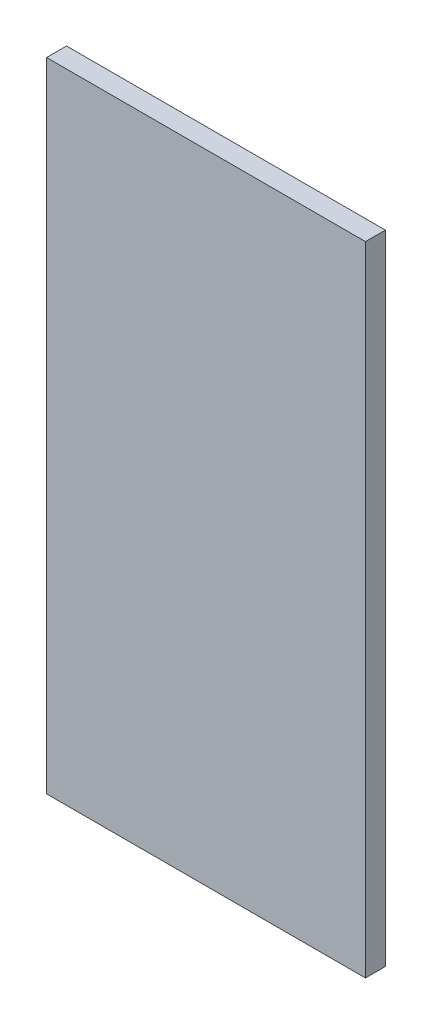
ISO-10303-21;
HEADER;
FILE_DESCRIPTION(('STEP AP214'),'2;1');
FILE_NAME('part.step','',(''),(''),'','','');
FILE_SCHEMA(('AUTOMOTIVE_DESIGN { 1 0 10303 214 1 1 1 1 }'));
ENDSEC;
DATA;
#1=APPLICATION_CONTEXT('core data for automotive mechanical design processes');
#2=APPLICATION_PROTOCOL_DEFINITION('international standard','automotive_design',2000,#1);
#3=PRODUCT_CONTEXT('',#1,'mechanical');
#4=PRODUCT('Part','Part','',(#3));
#5=PRODUCT_RELATED_PRODUCT_CATEGORY('part','',(#4));
#6=PRODUCT_DEFINITION_FORMATION('','',#4);
#7=PRODUCT_DEFINITION_CONTEXT('part definition',#1,'design');
#8=PRODUCT_DEFINITION('design','',#6,#7);
#9=PRODUCT_DEFINITION_SHAPE('','',#8);
#10=(LENGTH_UNIT() NAMED_UNIT(*) SI_UNIT(.MILLI.,.METRE.));
#11=(NAMED_UNIT(*) PLANE_ANGLE_UNIT() SI_UNIT($,.RADIAN.));
#12=(NAMED_UNIT(*) SI_UNIT($,.STERADIAN.) SOLID_ANGLE_UNIT());
#13=UNCERTAINTY_MEASURE_WITH_UNIT(LENGTH_MEASURE(1.E-05),#10,'distance_accuracy_value','');
#14=(GEOMETRIC_REPRESENTATION_CONTEXT(3) GLOBAL_UNCERTAINTY_ASSIGNED_CONTEXT((#13)) GLOBAL_UNIT_ASSIGNED_CONTEXT((#10,
#11,#12)) REPRESENTATION_CONTEXT('',''));
#15=CARTESIAN_POINT('',(0.,0.,0.));
#16=DIRECTION('',(0.,0.,1.));
#17=DIRECTION('',(1.,0.,0.));
#18=AXIS2_PLACEMENT_3D('',#15,#16,#17);
#19=CARTESIAN_POINT('',(0.,0.,3.175));
#20=DIRECTION('',(1.,0.,0.));
#21=DIRECTION('',(0.,1.,0.));
#22=AXIS2_PLACEMENT_3D('',#19,#20,#21);
#23=PLANE('',#22);
#24=DIRECTION('',(0.,-1.,0.));
#25=VECTOR('',#24,1.);
#26=CARTESIAN_POINT('',(0.,0.,0.));
#27=LINE('',#26,#25);
#28=CARTESIAN_POINT('',(0.,101.6,0.));
#29=VERTEX_POINT('',#28);
#30=CARTESIAN_POINT('',(0.,0.,0.));
#31=VERTEX_POINT('',#30);
#32=EDGE_CURVE('E113',#29,#31,#27,.T.);
#33=ORIENTED_EDGE('',*,*,#32,.T.);
#34=DIRECTION('',(0.,0.,-1.));
#35=VECTOR('',#34,1.);
#36=CARTESIAN_POINT('',(0.,0.,3.175));
#37=LINE('',#36,#35);
#38=CARTESIAN_POINT('',(0.,0.,3.175));
#39=VERTEX_POINT('',#38);
#40=EDGE_CURVE('E11',#39,#31,#37,.T.);
#41=ORIENTED_EDGE('',*,*,#40,.F.);
#42=DIRECTION('',(0.,-1.,0.));
#43=VECTOR('',#42,1.);
#44=CARTESIAN_POINT('',(0.,0.,3.175));
#45=LINE('',#44,#43);
#46=CARTESIAN_POINT('',(0.,101.6,3.175));
#47=VERTEX_POINT('',#46);
#48=EDGE_CURVE('E97',#47,#39,#45,.T.);
#49=ORIENTED_EDGE('',*,*,#48,.F.);
#50=DIRECTION('',(0.,0.,-1.));
#51=VECTOR('',#50,1.);
#52=CARTESIAN_POINT('',(0.,101.6,3.175));
#53=LINE('',#52,#51);
#54=EDGE_CURVE('E109',#47,#29,#53,.T.);
#55=ORIENTED_EDGE('',*,*,#54,.T.);
#56=EDGE_LOOP('',(#33,#41,#49,#55));
#57=FACE_BOUND('',#56,.T.);
#58=ADVANCED_FACE('F45',(#57),#23,.F.);
#59=CARTESIAN_POINT('',(0.,0.,3.175));
#60=DIRECTION('',(0.,1.,0.));
#61=DIRECTION('',(0.,0.,1.));
#62=AXIS2_PLACEMENT_3D('',#59,#60,#61);
#63=PLANE('',#62);
#64=DIRECTION('',(1.,0.,0.));
#65=VECTOR('',#64,1.);
#66=CARTESIAN_POINT('',(0.,0.,0.));
#67=LINE('',#66,#65);
#68=CARTESIAN_POINT('',(50.8,0.,0.));
#69=VERTEX_POINT('',#68);
#70=EDGE_CURVE('E102',#31,#69,#67,.T.);
#71=ORIENTED_EDGE('',*,*,#70,.T.);
#72=DIRECTION('',(0.,0.,-1.));
#73=VECTOR('',#72,1.);
#74=CARTESIAN_POINT('',(50.8,0.,3.175));
#75=LINE('',#74,#73);
#76=CARTESIAN_POINT('',(50.8,0.,3.175));
#77=VERTEX_POINT('',#76);
#78=EDGE_CURVE('E54',#77,#69,#75,.T.);
#79=ORIENTED_EDGE('',*,*,#78,.F.);
#80=DIRECTION('',(1.,0.,0.));
#81=VECTOR('',#80,1.);
#82=CARTESIAN_POINT('',(0.,0.,3.175));
#83=LINE('',#82,#81);
#84=EDGE_CURVE('E92',#39,#77,#83,.T.);
#85=ORIENTED_EDGE('',*,*,#84,.F.);
#86=ORIENTED_EDGE('',*,*,#40,.T.);
#87=EDGE_LOOP('',(#71,#79,#85,#86));
#88=FACE_BOUND('',#87,.T.);
#89=ADVANCED_FACE('F101',(#88),#63,.F.);
#90=CARTESIAN_POINT('',(50.8,0.,3.175));
#91=DIRECTION('',(-1.,0.,0.));
#92=DIRECTION('',(0.,-1.,0.));
#93=AXIS2_PLACEMENT_3D('',#90,#91,#92);
#94=PLANE('',#93);
#95=DIRECTION('',(0.,1.,0.));
#96=VECTOR('',#95,1.);
#97=CARTESIAN_POINT('',(50.8,0.,0.));
#98=LINE('',#97,#96);
#99=CARTESIAN_POINT('',(50.8,101.6,0.));
#100=VERTEX_POINT('',#99);
#101=EDGE_CURVE('E79',#69,#100,#98,.T.);
#102=ORIENTED_EDGE('',*,*,#101,.T.);
#103=DIRECTION('',(0.,0.,-1.));
#104=VECTOR('',#103,1.);
#105=CARTESIAN_POINT('',(50.8,101.6,3.175));
#106=LINE('',#105,#104);
#107=CARTESIAN_POINT('',(50.8,101.6,3.175));
#108=VERTEX_POINT('',#107);
#109=EDGE_CURVE('E104',#108,#100,#106,.T.);
#110=ORIENTED_EDGE('',*,*,#109,.F.);
#111=DIRECTION('',(0.,1.,0.));
#112=VECTOR('',#111,1.);
#113=CARTESIAN_POINT('',(50.8,0.,3.175));
#114=LINE('',#113,#112);
#115=EDGE_CURVE('E95',#77,#108,#114,.T.);
#116=ORIENTED_EDGE('',*,*,#115,.F.);
#117=ORIENTED_EDGE('',*,*,#78,.T.);
#118=EDGE_LOOP('',(#102,#110,#116,#117));
#119=FACE_BOUND('',#118,.T.);
#120=ADVANCED_FACE('F105',(#119),#94,.F.);
#121=CARTESIAN_POINT('',(0.,101.6,3.175));
#122=DIRECTION('',(0.,-1.,0.));
#123=DIRECTION('',(0.,0.,-1.));
#124=AXIS2_PLACEMENT_3D('',#121,#122,#123);
#125=PLANE('',#124);
#126=DIRECTION('',(-1.,0.,0.));
#127=VECTOR('',#126,1.);
#128=CARTESIAN_POINT('',(0.,101.6,0.));
#129=LINE('',#128,#127);
#130=EDGE_CURVE('E85',#100,#29,#129,.T.);
#131=ORIENTED_EDGE('',*,*,#130,.T.);
#132=ORIENTED_EDGE('',*,*,#54,.F.);
#133=DIRECTION('',(-1.,0.,0.));
#134=VECTOR('',#133,1.);
#135=CARTESIAN_POINT('',(0.,101.6,3.175));
#136=LINE('',#135,#134);
#137=EDGE_CURVE('E62',#108,#47,#136,.T.);
#138=ORIENTED_EDGE('',*,*,#137,.F.);
#139=ORIENTED_EDGE('',*,*,#109,.T.);
#140=EDGE_LOOP('',(#131,#132,#138,#139));
#141=FACE_BOUND('',#140,.T.);
#142=ADVANCED_FACE('F126',(#141),#125,.F.);
#143=CARTESIAN_POINT('',(0.,0.,3.175));
#144=DIRECTION('',(0.,0.,-1.));
#145=DIRECTION('',(-1.,0.,0.));
#146=AXIS2_PLACEMENT_3D('',#143,#144,#145);
#147=PLANE('',#146);
#148=ORIENTED_EDGE('',*,*,#48,.T.);
#149=ORIENTED_EDGE('',*,*,#84,.T.);
#150=ORIENTED_EDGE('',*,*,#115,.T.);
#151=ORIENTED_EDGE('',*,*,#137,.T.);
#152=EDGE_LOOP('',(#148,#149,#150,#151));
#153=FACE_BOUND('',#152,.T.);
#154=ADVANCED_FACE('F93',(#153),#147,.F.);
#155=CARTESIAN_POINT('',(0.,0.,0.));
#156=DIRECTION('',(0.,0.,-1.));
#157=DIRECTION('',(-1.,0.,0.));
#158=AXIS2_PLACEMENT_3D('',#155,#156,#157);
#159=PLANE('',#158);
#160=ORIENTED_EDGE('',*,*,#32,.F.);
#161=ORIENTED_EDGE('',*,*,#130,.F.);
#162=ORIENTED_EDGE('',*,*,#101,.F.);
#163=ORIENTED_EDGE('',*,*,#70,.F.);
#164=EDGE_LOOP('',(#160,#161,#162,#163));
#165=FACE_BOUND('',#164,.T.);
#166=ADVANCED_FACE('F129',(#165),#159,.T.);
#167=CLOSED_SHELL('',(#58,#89,#120,#142,#154,#166));
#168=MANIFOLD_SOLID_BREP('B2',#167);
#169=ADVANCED_BREP_SHAPE_REPRESENTATION('',(#18,#168),#14);
#170=SHAPE_DEFINITION_REPRESENTATION(#9,#169);
ENDSEC;
END-ISO-10303-21;
